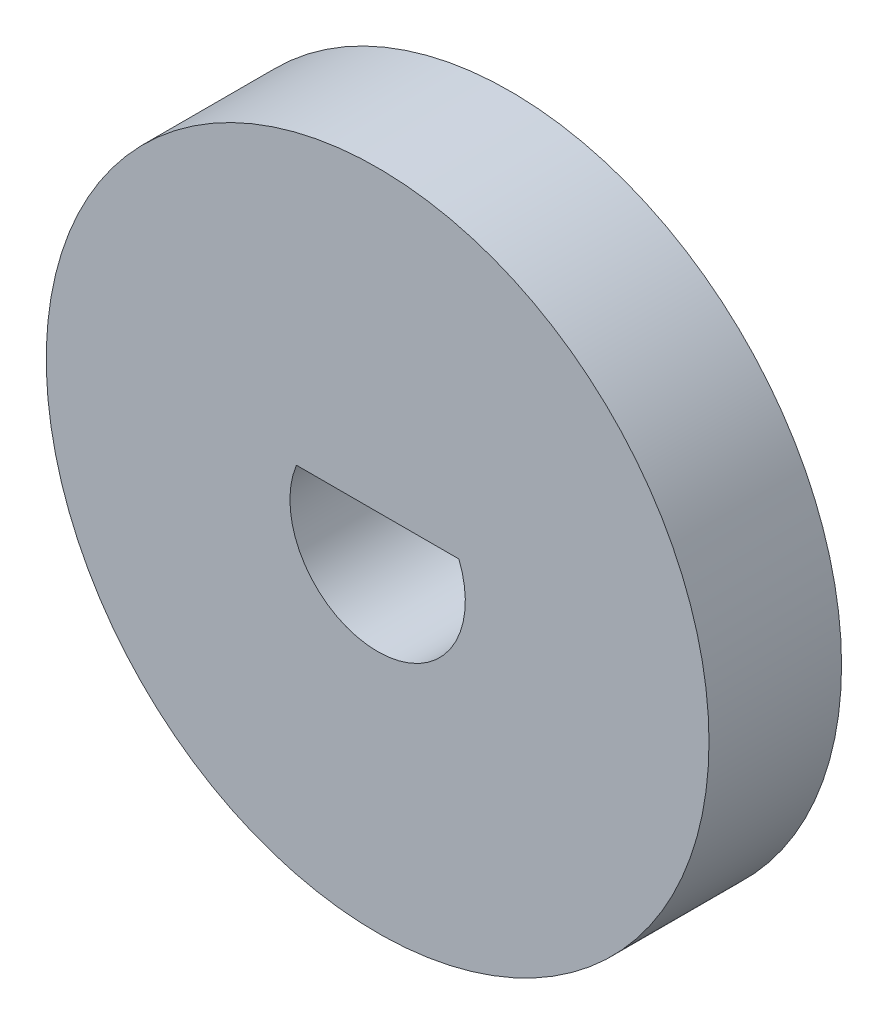
ISO-10303-21;
HEADER;
FILE_DESCRIPTION(('STEP AP214'),'2;1');
FILE_NAME('part.step','',(''),(''),'','','');
FILE_SCHEMA(('AUTOMOTIVE_DESIGN { 1 0 10303 214 1 1 1 1 }'));
ENDSEC;
DATA;
#1=APPLICATION_CONTEXT('core data for automotive mechanical design processes');
#2=APPLICATION_PROTOCOL_DEFINITION('international standard','automotive_design',2000,#1);
#3=PRODUCT_CONTEXT('',#1,'mechanical');
#4=PRODUCT('Part','Part','',(#3));
#5=PRODUCT_RELATED_PRODUCT_CATEGORY('part','',(#4));
#6=PRODUCT_DEFINITION_FORMATION('','',#4);
#7=PRODUCT_DEFINITION_CONTEXT('part definition',#1,'design');
#8=PRODUCT_DEFINITION('design','',#6,#7);
#9=PRODUCT_DEFINITION_SHAPE('','',#8);
#10=(LENGTH_UNIT() NAMED_UNIT(*) SI_UNIT(.MILLI.,.METRE.));
#11=(NAMED_UNIT(*) PLANE_ANGLE_UNIT() SI_UNIT($,.RADIAN.));
#12=(NAMED_UNIT(*) SI_UNIT($,.STERADIAN.) SOLID_ANGLE_UNIT());
#13=UNCERTAINTY_MEASURE_WITH_UNIT(LENGTH_MEASURE(1.E-05),#10,'distance_accuracy_value','');
#14=(GEOMETRIC_REPRESENTATION_CONTEXT(3) GLOBAL_UNCERTAINTY_ASSIGNED_CONTEXT((#13)) GLOBAL_UNIT_ASSIGNED_CONTEXT((#10,
#11,#12)) REPRESENTATION_CONTEXT('',''));
#15=CARTESIAN_POINT('',(0.,0.,0.));
#16=DIRECTION('',(0.,0.,1.));
#17=DIRECTION('',(1.,0.,0.));
#18=AXIS2_PLACEMENT_3D('',#15,#16,#17);
#19=CARTESIAN_POINT('',(0.,0.,8.));
#20=DIRECTION('',(0.,0.,1.));
#21=DIRECTION('',(1.,0.,0.));
#22=AXIS2_PLACEMENT_3D('',#19,#20,#21);
#23=PLANE('',#22);
#24=CARTESIAN_POINT('',(0.,0.,8.));
#25=DIRECTION('',(0.,0.,1.));
#26=DIRECTION('',(1.,0.,0.));
#27=AXIS2_PLACEMENT_3D('',#24,#25,#26);
#28=CIRCLE('',#27,20.);
#29=CARTESIAN_POINT('',(20.,0.,8.));
#30=VERTEX_POINT('',#29);
#31=EDGE_CURVE('E11',#30,#30,#28,.T.);
#32=ORIENTED_EDGE('',*,*,#31,.T.);
#33=EDGE_LOOP('',(#32));
#34=FACE_BOUND('',#33,.T.);
#35=DIRECTION('',(-1.,0.,0.));
#36=VECTOR('',#35,1.);
#37=CARTESIAN_POINT('',(4.9,2.,8.));
#38=LINE('',#37,#36);
#39=CARTESIAN_POINT('',(4.9,2.,8.));
#40=VERTEX_POINT('',#39);
#41=CARTESIAN_POINT('',(-4.9,2.,8.));
#42=VERTEX_POINT('',#41);
#43=EDGE_CURVE('E82',#40,#42,#38,.T.);
#44=ORIENTED_EDGE('',*,*,#43,.F.);
#45=CARTESIAN_POINT('',(0.,0.,8.));
#46=DIRECTION('',(0.,0.,1.));
#47=DIRECTION('',(1.,0.,0.));
#48=AXIS2_PLACEMENT_3D('',#45,#46,#47);
#49=CIRCLE('',#48,5.2924474489597);
#50=EDGE_CURVE('E73',#42,#40,#49,.T.);
#51=ORIENTED_EDGE('',*,*,#50,.F.);
#52=EDGE_LOOP('',(#44,#51));
#53=FACE_BOUND('',#52,.T.);
#54=ADVANCED_FACE('F41',(#34,#53),#23,.T.);
#55=CARTESIAN_POINT('',(0.,0.,0.));
#56=DIRECTION('',(0.,0.,1.));
#57=DIRECTION('',(1.,0.,0.));
#58=AXIS2_PLACEMENT_3D('',#55,#56,#57);
#59=PLANE('',#58);
#60=CARTESIAN_POINT('',(0.,0.,0.));
#61=DIRECTION('',(0.,0.,1.));
#62=DIRECTION('',(1.,0.,0.));
#63=AXIS2_PLACEMENT_3D('',#60,#61,#62);
#64=CIRCLE('',#63,20.);
#65=CARTESIAN_POINT('',(20.,0.,0.));
#66=VERTEX_POINT('',#65);
#67=EDGE_CURVE('E45',#66,#66,#64,.T.);
#68=ORIENTED_EDGE('',*,*,#67,.F.);
#69=EDGE_LOOP('',(#68));
#70=FACE_BOUND('',#69,.T.);
#71=CARTESIAN_POINT('',(0.,0.,0.));
#72=DIRECTION('',(0.,0.,1.));
#73=DIRECTION('',(1.,0.,0.));
#74=AXIS2_PLACEMENT_3D('',#71,#72,#73);
#75=CIRCLE('',#74,5.2924474489597);
#76=CARTESIAN_POINT('',(-4.9,2.,0.));
#77=VERTEX_POINT('',#76);
#78=CARTESIAN_POINT('',(4.9,2.,0.));
#79=VERTEX_POINT('',#78);
#80=EDGE_CURVE('E63',#77,#79,#75,.T.);
#81=ORIENTED_EDGE('',*,*,#80,.T.);
#82=DIRECTION('',(-1.,0.,0.));
#83=VECTOR('',#82,1.);
#84=CARTESIAN_POINT('',(4.9,2.,0.));
#85=LINE('',#84,#83);
#86=EDGE_CURVE('E69',#79,#77,#85,.T.);
#87=ORIENTED_EDGE('',*,*,#86,.T.);
#88=EDGE_LOOP('',(#81,#87));
#89=FACE_BOUND('',#88,.T.);
#90=ADVANCED_FACE('F79',(#70,#89),#59,.F.);
#91=CARTESIAN_POINT('',(0.,0.,8.));
#92=DIRECTION('',(0.,0.,-1.));
#93=DIRECTION('',(-1.,0.,0.));
#94=AXIS2_PLACEMENT_3D('',#91,#92,#93);
#95=CYLINDRICAL_SURFACE('',#94,20.);
#96=ORIENTED_EDGE('',*,*,#31,.F.);
#97=EDGE_LOOP('',(#96));
#98=FACE_BOUND('',#97,.T.);
#99=ORIENTED_EDGE('',*,*,#67,.T.);
#100=EDGE_LOOP('',(#99));
#101=FACE_BOUND('',#100,.T.);
#102=ADVANCED_FACE('F43',(#98,#101),#95,.T.);
#103=CARTESIAN_POINT('',(0.,0.,8.));
#104=DIRECTION('',(0.,0.,-1.));
#105=DIRECTION('',(-1.,0.,0.));
#106=AXIS2_PLACEMENT_3D('',#103,#104,#105);
#107=CYLINDRICAL_SURFACE('',#106,5.2924474489597);
#108=ORIENTED_EDGE('',*,*,#80,.F.);
#109=DIRECTION('',(0.,0.,-1.));
#110=VECTOR('',#109,1.);
#111=CARTESIAN_POINT('',(-4.9,2.,8.));
#112=LINE('',#111,#110);
#113=EDGE_CURVE('E71',#42,#77,#112,.T.);
#114=ORIENTED_EDGE('',*,*,#113,.F.);
#115=ORIENTED_EDGE('',*,*,#50,.T.);
#116=DIRECTION('',(0.,0.,-1.));
#117=VECTOR('',#116,1.);
#118=CARTESIAN_POINT('',(4.9,2.,8.));
#119=LINE('',#118,#117);
#120=EDGE_CURVE('E56',#40,#79,#119,.T.);
#121=ORIENTED_EDGE('',*,*,#120,.T.);
#122=EDGE_LOOP('',(#108,#114,#115,#121));
#123=FACE_BOUND('',#122,.T.);
#124=ADVANCED_FACE('F75',(#123),#107,.F.);
#125=CARTESIAN_POINT('',(4.9,2.,8.));
#126=DIRECTION('',(0.,-1.,0.));
#127=DIRECTION('',(0.,0.,-1.));
#128=AXIS2_PLACEMENT_3D('',#125,#126,#127);
#129=PLANE('',#128);
#130=ORIENTED_EDGE('',*,*,#86,.F.);
#131=ORIENTED_EDGE('',*,*,#120,.F.);
#132=ORIENTED_EDGE('',*,*,#43,.T.);
#133=ORIENTED_EDGE('',*,*,#113,.T.);
#134=EDGE_LOOP('',(#130,#131,#132,#133));
#135=FACE_BOUND('',#134,.T.);
#136=ADVANCED_FACE('F70',(#135),#129,.T.);
#137=CLOSED_SHELL('',(#54,#90,#102,#124,#136));
#138=MANIFOLD_SOLID_BREP('B2',#137);
#139=ADVANCED_BREP_SHAPE_REPRESENTATION('',(#18,#138),#14);
#140=SHAPE_DEFINITION_REPRESENTATION(#9,#139);
ENDSEC;
END-ISO-10303-21;
